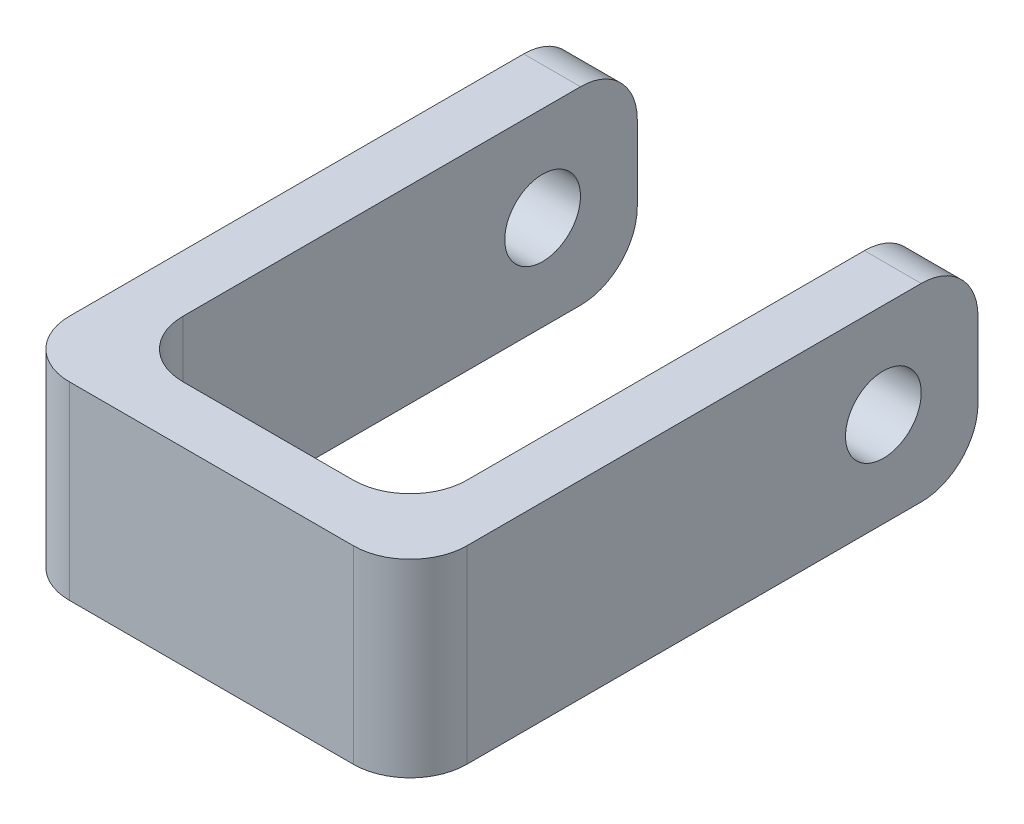
ISO-10303-21;
HEADER;
FILE_DESCRIPTION(('STEP AP214'),'2;1');
FILE_NAME('part.step','',(''),(''),'','','');
FILE_SCHEMA(('AUTOMOTIVE_DESIGN { 1 0 10303 214 1 1 1 1 }'));
ENDSEC;
DATA;
#1=APPLICATION_CONTEXT('core data for automotive mechanical design processes');
#2=APPLICATION_PROTOCOL_DEFINITION('international standard','automotive_design',2000,#1);
#3=PRODUCT_CONTEXT('',#1,'mechanical');
#4=PRODUCT('Part','Part','',(#3));
#5=PRODUCT_RELATED_PRODUCT_CATEGORY('part','',(#4));
#6=PRODUCT_DEFINITION_FORMATION('','',#4);
#7=PRODUCT_DEFINITION_CONTEXT('part definition',#1,'design');
#8=PRODUCT_DEFINITION('design','',#6,#7);
#9=PRODUCT_DEFINITION_SHAPE('','',#8);
#10=(LENGTH_UNIT() NAMED_UNIT(*) SI_UNIT(.MILLI.,.METRE.));
#11=(NAMED_UNIT(*) PLANE_ANGLE_UNIT() SI_UNIT($,.RADIAN.));
#12=(NAMED_UNIT(*) SI_UNIT($,.STERADIAN.) SOLID_ANGLE_UNIT());
#13=UNCERTAINTY_MEASURE_WITH_UNIT(LENGTH_MEASURE(1.E-05),#10,'distance_accuracy_value','');
#14=(GEOMETRIC_REPRESENTATION_CONTEXT(3) GLOBAL_UNCERTAINTY_ASSIGNED_CONTEXT((#13)) GLOBAL_UNIT_ASSIGNED_CONTEXT((#10,
#11,#12)) REPRESENTATION_CONTEXT('',''));
#15=CARTESIAN_POINT('',(0.,0.,0.));
#16=DIRECTION('',(0.,0.,1.));
#17=DIRECTION('',(1.,0.,0.));
#18=AXIS2_PLACEMENT_3D('',#15,#16,#17);
#19=CARTESIAN_POINT('',(0.,0.,-60.));
#20=DIRECTION('',(0.,0.,-1.));
#21=DIRECTION('',(-1.,0.,0.));
#22=AXIS2_PLACEMENT_3D('',#19,#20,#21);
#23=PLANE('',#22);
#24=DIRECTION('',(0.,-1.,0.));
#25=VECTOR('',#24,1.);
#26=CARTESIAN_POINT('',(-21.,10.,-60.));
#27=LINE('',#26,#25);
#28=CARTESIAN_POINT('',(-21.,4.,-60.));
#29=VERTEX_POINT('',#28);
#30=CARTESIAN_POINT('',(-21.,-4.,-60.));
#31=VERTEX_POINT('',#30);
#32=EDGE_CURVE('E240',#29,#31,#27,.T.);
#33=ORIENTED_EDGE('',*,*,#32,.F.);
#34=DIRECTION('',(-1.,0.,0.));
#35=VECTOR('',#34,1.);
#36=CARTESIAN_POINT('',(0.,4.,-60.));
#37=LINE('',#36,#35);
#38=CARTESIAN_POINT('',(-15.,4.,-60.));
#39=VERTEX_POINT('',#38);
#40=EDGE_CURVE('E173',#29,#39,#37,.F.);
#41=ORIENTED_EDGE('',*,*,#40,.T.);
#42=DIRECTION('',(0.,-1.,0.));
#43=VECTOR('',#42,1.);
#44=CARTESIAN_POINT('',(-15.,10.,-60.));
#45=LINE('',#44,#43);
#46=CARTESIAN_POINT('',(-15.,-4.,-60.));
#47=VERTEX_POINT('',#46);
#48=EDGE_CURVE('E237',#39,#47,#45,.T.);
#49=ORIENTED_EDGE('',*,*,#48,.T.);
#50=DIRECTION('',(1.,0.,0.));
#51=VECTOR('',#50,1.);
#52=CARTESIAN_POINT('',(0.,-4.,-60.));
#53=LINE('',#52,#51);
#54=EDGE_CURVE('E176',#47,#31,#53,.F.);
#55=ORIENTED_EDGE('',*,*,#54,.T.);
#56=EDGE_LOOP('',(#33,#41,#49,#55));
#57=FACE_BOUND('',#56,.T.);
#58=ADVANCED_FACE('F33',(#57),#23,.T.);
#59=CARTESIAN_POINT('',(-21.,10.,-60.));
#60=DIRECTION('',(-1.,0.,0.));
#61=DIRECTION('',(0.,0.,1.));
#62=AXIS2_PLACEMENT_3D('',#59,#60,#61);
#63=PLANE('',#62);
#64=CARTESIAN_POINT('',(-21.,0.,-50.));
#65=DIRECTION('',(1.,0.,0.));
#66=DIRECTION('',(0.,0.,-1.));
#67=AXIS2_PLACEMENT_3D('',#64,#65,#66);
#68=CIRCLE('',#67,4.00000000000001);
#69=CARTESIAN_POINT('',(-21.,0.,-54.));
#70=VERTEX_POINT('',#69);
#71=EDGE_CURVE('E296',#70,#70,#68,.T.);
#72=ORIENTED_EDGE('',*,*,#71,.T.);
#73=EDGE_LOOP('',(#72));
#74=FACE_BOUND('',#73,.T.);
#75=DIRECTION('',(0.,0.,1.));
#76=VECTOR('',#75,1.);
#77=CARTESIAN_POINT('',(-21.,10.,-60.));
#78=LINE('',#77,#76);
#79=CARTESIAN_POINT('',(-21.,10.,-54.));
#80=VERTEX_POINT('',#79);
#81=CARTESIAN_POINT('',(-21.,10.,-6.));
#82=VERTEX_POINT('',#81);
#83=EDGE_CURVE('E251',#80,#82,#78,.T.);
#84=ORIENTED_EDGE('',*,*,#83,.F.);
#85=CARTESIAN_POINT('',(-21.,4.,-54.));
#86=DIRECTION('',(-1.,0.,0.));
#87=DIRECTION('',(0.,0.,1.));
#88=AXIS2_PLACEMENT_3D('',#85,#86,#87);
#89=CIRCLE('',#88,6.);
#90=EDGE_CURVE('E274',#80,#29,#89,.T.);
#91=ORIENTED_EDGE('',*,*,#90,.T.);
#92=ORIENTED_EDGE('',*,*,#32,.T.);
#93=CARTESIAN_POINT('',(-21.,-4.,-54.));
#94=DIRECTION('',(-1.,0.,0.));
#95=DIRECTION('',(0.,0.,1.));
#96=AXIS2_PLACEMENT_3D('',#93,#94,#95);
#97=CIRCLE('',#96,6.);
#98=CARTESIAN_POINT('',(-21.,-10.,-54.));
#99=VERTEX_POINT('',#98);
#100=EDGE_CURVE('E272',#31,#99,#97,.T.);
#101=ORIENTED_EDGE('',*,*,#100,.T.);
#102=DIRECTION('',(0.,0.,1.));
#103=VECTOR('',#102,1.);
#104=CARTESIAN_POINT('',(-21.,-10.,-60.));
#105=LINE('',#104,#103);
#106=CARTESIAN_POINT('',(-21.,-10.,-6.));
#107=VERTEX_POINT('',#106);
#108=EDGE_CURVE('E247',#99,#107,#105,.T.);
#109=ORIENTED_EDGE('',*,*,#108,.T.);
#110=DIRECTION('',(0.,-1.,0.));
#111=VECTOR('',#110,1.);
#112=CARTESIAN_POINT('',(-21.,10.,-6.));
#113=LINE('',#112,#111);
#114=EDGE_CURVE('E270',#107,#82,#113,.F.);
#115=ORIENTED_EDGE('',*,*,#114,.T.);
#116=EDGE_LOOP('',(#84,#91,#92,#101,#109,#115));
#117=FACE_BOUND('',#116,.T.);
#118=ADVANCED_FACE('F283',(#74,#117),#63,.T.);
#119=CARTESIAN_POINT('',(21.,10.,-60.));
#120=DIRECTION('',(0.,1.,0.));
#121=DIRECTION('',(0.,0.,1.));
#122=AXIS2_PLACEMENT_3D('',#119,#120,#121);
#123=PLANE('',#122);
#124=DIRECTION('',(0.,0.,-1.));
#125=VECTOR('',#124,1.);
#126=CARTESIAN_POINT('',(-15.,10.,-60.));
#127=LINE('',#126,#125);
#128=CARTESIAN_POINT('',(-15.,10.,-12.));
#129=VERTEX_POINT('',#128);
#130=CARTESIAN_POINT('',(-15.,10.,-54.));
#131=VERTEX_POINT('',#130);
#132=EDGE_CURVE('E153',#129,#131,#127,.T.);
#133=ORIENTED_EDGE('',*,*,#132,.T.);
#134=DIRECTION('',(-1.,0.,0.));
#135=VECTOR('',#134,1.);
#136=CARTESIAN_POINT('',(21.,10.,-54.));
#137=LINE('',#136,#135);
#138=EDGE_CURVE('E268',#131,#80,#137,.T.);
#139=ORIENTED_EDGE('',*,*,#138,.T.);
#140=ORIENTED_EDGE('',*,*,#83,.T.);
#141=CARTESIAN_POINT('',(-15.,10.,-6.));
#142=DIRECTION('',(0.,1.,0.));
#143=DIRECTION('',(0.,0.,1.));
#144=AXIS2_PLACEMENT_3D('',#141,#142,#143);
#145=CIRCLE('',#144,6.);
#146=CARTESIAN_POINT('',(-15.,10.,0.));
#147=VERTEX_POINT('',#146);
#148=EDGE_CURVE('E263',#82,#147,#145,.T.);
#149=ORIENTED_EDGE('',*,*,#148,.T.);
#150=DIRECTION('',(-1.,0.,0.));
#151=VECTOR('',#150,1.);
#152=CARTESIAN_POINT('',(21.,10.,0.));
#153=LINE('',#152,#151);
#154=CARTESIAN_POINT('',(15.,10.,0.));
#155=VERTEX_POINT('',#154);
#156=EDGE_CURVE('E244',#155,#147,#153,.T.);
#157=ORIENTED_EDGE('',*,*,#156,.F.);
#158=CARTESIAN_POINT('',(15.,10.,-6.));
#159=DIRECTION('',(0.,1.,0.));
#160=DIRECTION('',(0.,0.,1.));
#161=AXIS2_PLACEMENT_3D('',#158,#159,#160);
#162=CIRCLE('',#161,6.);
#163=CARTESIAN_POINT('',(21.,10.,-6.));
#164=VERTEX_POINT('',#163);
#165=EDGE_CURVE('E254',#155,#164,#162,.T.);
#166=ORIENTED_EDGE('',*,*,#165,.T.);
#167=DIRECTION('',(0.,0.,1.));
#168=VECTOR('',#167,1.);
#169=CARTESIAN_POINT('',(21.,10.,-60.));
#170=LINE('',#169,#168);
#171=CARTESIAN_POINT('',(21.,10.,-54.));
#172=VERTEX_POINT('',#171);
#173=EDGE_CURVE('E255',#172,#164,#170,.T.);
#174=ORIENTED_EDGE('',*,*,#173,.F.);
#175=DIRECTION('',(-1.,0.,0.));
#176=VECTOR('',#175,1.);
#177=CARTESIAN_POINT('',(21.,10.,-54.));
#178=LINE('',#177,#176);
#179=CARTESIAN_POINT('',(15.,10.,-54.));
#180=VERTEX_POINT('',#179);
#181=EDGE_CURVE('E265',#172,#180,#178,.T.);
#182=ORIENTED_EDGE('',*,*,#181,.T.);
#183=DIRECTION('',(0.,0.,1.));
#184=VECTOR('',#183,1.);
#185=CARTESIAN_POINT('',(15.,10.,-60.));
#186=LINE('',#185,#184);
#187=CARTESIAN_POINT('',(15.,10.,-12.));
#188=VERTEX_POINT('',#187);
#189=EDGE_CURVE('E169',#180,#188,#186,.T.);
#190=ORIENTED_EDGE('',*,*,#189,.T.);
#191=CARTESIAN_POINT('',(9.,10.,-12.));
#192=DIRECTION('',(0.,1.,0.));
#193=DIRECTION('',(0.,0.,1.));
#194=AXIS2_PLACEMENT_3D('',#191,#192,#193);
#195=CIRCLE('',#194,6.);
#196=CARTESIAN_POINT('',(9.,10.,-6.));
#197=VERTEX_POINT('',#196);
#198=EDGE_CURVE('E217',#188,#197,#195,.F.);
#199=ORIENTED_EDGE('',*,*,#198,.T.);
#200=DIRECTION('',(-1.,0.,0.));
#201=VECTOR('',#200,1.);
#202=CARTESIAN_POINT('',(-15.,10.,-6.));
#203=LINE('',#202,#201);
#204=CARTESIAN_POINT('',(-9.,10.,-6.));
#205=VERTEX_POINT('',#204);
#206=EDGE_CURVE('E156',#197,#205,#203,.T.);
#207=ORIENTED_EDGE('',*,*,#206,.T.);
#208=CARTESIAN_POINT('',(-9.,10.,-12.));
#209=DIRECTION('',(0.,1.,0.));
#210=DIRECTION('',(0.,0.,1.));
#211=AXIS2_PLACEMENT_3D('',#208,#209,#210);
#212=CIRCLE('',#211,6.);
#213=EDGE_CURVE('E11',#205,#129,#212,.F.);
#214=ORIENTED_EDGE('',*,*,#213,.T.);
#215=EDGE_LOOP('',(#133,#139,#140,#149,#157,#166,#174,#182,#190,#199,#207,#214));
#216=FACE_BOUND('',#215,.T.);
#217=ADVANCED_FACE('F151',(#216),#123,.T.);
#218=CARTESIAN_POINT('',(21.,10.,-60.));
#219=DIRECTION('',(1.,0.,0.));
#220=DIRECTION('',(0.,0.,-1.));
#221=AXIS2_PLACEMENT_3D('',#218,#219,#220);
#222=PLANE('',#221);
#223=CARTESIAN_POINT('',(21.,0.,-50.));
#224=DIRECTION('',(1.,0.,0.));
#225=DIRECTION('',(0.,0.,-1.));
#226=AXIS2_PLACEMENT_3D('',#223,#224,#225);
#227=CIRCLE('',#226,4.00000000000001);
#228=CARTESIAN_POINT('',(21.,0.,-54.));
#229=VERTEX_POINT('',#228);
#230=EDGE_CURVE('E293',#229,#229,#227,.T.);
#231=ORIENTED_EDGE('',*,*,#230,.F.);
#232=EDGE_LOOP('',(#231));
#233=FACE_BOUND('',#232,.T.);
#234=DIRECTION('',(0.,1.,0.));
#235=VECTOR('',#234,1.);
#236=CARTESIAN_POINT('',(21.,10.,-60.));
#237=LINE('',#236,#235);
#238=CARTESIAN_POINT('',(21.,-4.,-60.));
#239=VERTEX_POINT('',#238);
#240=CARTESIAN_POINT('',(21.,4.,-60.));
#241=VERTEX_POINT('',#240);
#242=EDGE_CURVE('E243',#239,#241,#237,.T.);
#243=ORIENTED_EDGE('',*,*,#242,.T.);
#244=CARTESIAN_POINT('',(21.,4.,-54.));
#245=DIRECTION('',(1.,0.,0.));
#246=DIRECTION('',(0.,0.,-1.));
#247=AXIS2_PLACEMENT_3D('',#244,#245,#246);
#248=CIRCLE('',#247,6.);
#249=EDGE_CURVE('E195',#241,#172,#248,.T.);
#250=ORIENTED_EDGE('',*,*,#249,.T.);
#251=ORIENTED_EDGE('',*,*,#173,.T.);
#252=DIRECTION('',(0.,1.,0.));
#253=VECTOR('',#252,1.);
#254=CARTESIAN_POINT('',(21.,-10.,-6.));
#255=LINE('',#254,#253);
#256=CARTESIAN_POINT('',(21.,-10.,-6.));
#257=VERTEX_POINT('',#256);
#258=EDGE_CURVE('E191',#164,#257,#255,.F.);
#259=ORIENTED_EDGE('',*,*,#258,.T.);
#260=DIRECTION('',(0.,0.,1.));
#261=VECTOR('',#260,1.);
#262=CARTESIAN_POINT('',(21.,-10.,-60.));
#263=LINE('',#262,#261);
#264=CARTESIAN_POINT('',(21.,-10.,-54.));
#265=VERTEX_POINT('',#264);
#266=EDGE_CURVE('E258',#265,#257,#263,.T.);
#267=ORIENTED_EDGE('',*,*,#266,.F.);
#268=CARTESIAN_POINT('',(21.,-4.,-54.));
#269=DIRECTION('',(1.,0.,0.));
#270=DIRECTION('',(0.,0.,-1.));
#271=AXIS2_PLACEMENT_3D('',#268,#269,#270);
#272=CIRCLE('',#271,6.);
#273=EDGE_CURVE('E193',#265,#239,#272,.T.);
#274=ORIENTED_EDGE('',*,*,#273,.T.);
#275=EDGE_LOOP('',(#243,#250,#251,#259,#267,#274));
#276=FACE_BOUND('',#275,.T.);
#277=ADVANCED_FACE('F335',(#233,#276),#222,.T.);
#278=CARTESIAN_POINT('',(21.,-10.,-60.));
#279=DIRECTION('',(0.,-1.,0.));
#280=DIRECTION('',(0.,0.,-1.));
#281=AXIS2_PLACEMENT_3D('',#278,#279,#280);
#282=PLANE('',#281);
#283=ORIENTED_EDGE('',*,*,#108,.F.);
#284=DIRECTION('',(1.,0.,0.));
#285=VECTOR('',#284,1.);
#286=CARTESIAN_POINT('',(21.,-10.,-54.));
#287=LINE('',#286,#285);
#288=CARTESIAN_POINT('',(-15.,-10.,-54.));
#289=VERTEX_POINT('',#288);
#290=EDGE_CURVE('E202',#99,#289,#287,.T.);
#291=ORIENTED_EDGE('',*,*,#290,.T.);
#292=DIRECTION('',(0.,0.,-1.));
#293=VECTOR('',#292,1.);
#294=CARTESIAN_POINT('',(-15.,-10.,-60.));
#295=LINE('',#294,#293);
#296=CARTESIAN_POINT('',(-15.,-10.,-12.));
#297=VERTEX_POINT('',#296);
#298=EDGE_CURVE('E223',#297,#289,#295,.T.);
#299=ORIENTED_EDGE('',*,*,#298,.F.);
#300=CARTESIAN_POINT('',(-9.,-10.,-12.));
#301=DIRECTION('',(0.,-1.,0.));
#302=DIRECTION('',(0.,0.,-1.));
#303=AXIS2_PLACEMENT_3D('',#300,#301,#302);
#304=CIRCLE('',#303,6.);
#305=CARTESIAN_POINT('',(-9.,-10.,-6.));
#306=VERTEX_POINT('',#305);
#307=EDGE_CURVE('E42',#297,#306,#304,.F.);
#308=ORIENTED_EDGE('',*,*,#307,.T.);
#309=DIRECTION('',(-1.,0.,0.));
#310=VECTOR('',#309,1.);
#311=CARTESIAN_POINT('',(-15.,-10.,-6.));
#312=LINE('',#311,#310);
#313=CARTESIAN_POINT('',(9.,-10.,-6.));
#314=VERTEX_POINT('',#313);
#315=EDGE_CURVE('E170',#314,#306,#312,.T.);
#316=ORIENTED_EDGE('',*,*,#315,.F.);
#317=CARTESIAN_POINT('',(9.,-10.,-12.));
#318=DIRECTION('',(0.,-1.,0.));
#319=DIRECTION('',(0.,0.,-1.));
#320=AXIS2_PLACEMENT_3D('',#317,#318,#319);
#321=CIRCLE('',#320,6.);
#322=CARTESIAN_POINT('',(15.,-10.,-12.));
#323=VERTEX_POINT('',#322);
#324=EDGE_CURVE('E215',#314,#323,#321,.F.);
#325=ORIENTED_EDGE('',*,*,#324,.T.);
#326=DIRECTION('',(0.,0.,1.));
#327=VECTOR('',#326,1.);
#328=CARTESIAN_POINT('',(15.,-10.,-60.));
#329=LINE('',#328,#327);
#330=CARTESIAN_POINT('',(15.,-10.,-54.));
#331=VERTEX_POINT('',#330);
#332=EDGE_CURVE('E227',#331,#323,#329,.T.);
#333=ORIENTED_EDGE('',*,*,#332,.F.);
#334=DIRECTION('',(1.,0.,0.));
#335=VECTOR('',#334,1.);
#336=CARTESIAN_POINT('',(21.,-10.,-54.));
#337=LINE('',#336,#335);
#338=EDGE_CURVE('E199',#331,#265,#337,.T.);
#339=ORIENTED_EDGE('',*,*,#338,.T.);
#340=ORIENTED_EDGE('',*,*,#266,.T.);
#341=CARTESIAN_POINT('',(15.,-10.,-6.));
#342=DIRECTION('',(0.,-1.,0.));
#343=DIRECTION('',(0.,0.,-1.));
#344=AXIS2_PLACEMENT_3D('',#341,#342,#343);
#345=CIRCLE('',#344,6.);
#346=CARTESIAN_POINT('',(15.,-10.,0.));
#347=VERTEX_POINT('',#346);
#348=EDGE_CURVE('E49',#257,#347,#345,.T.);
#349=ORIENTED_EDGE('',*,*,#348,.T.);
#350=DIRECTION('',(1.,0.,0.));
#351=VECTOR('',#350,1.);
#352=CARTESIAN_POINT('',(21.,-10.,0.));
#353=LINE('',#352,#351);
#354=CARTESIAN_POINT('',(-15.,-10.,0.));
#355=VERTEX_POINT('',#354);
#356=EDGE_CURVE('E236',#355,#347,#353,.T.);
#357=ORIENTED_EDGE('',*,*,#356,.F.);
#358=CARTESIAN_POINT('',(-15.,-10.,-6.));
#359=DIRECTION('',(0.,-1.,0.));
#360=DIRECTION('',(0.,0.,-1.));
#361=AXIS2_PLACEMENT_3D('',#358,#359,#360);
#362=CIRCLE('',#361,6.);
#363=EDGE_CURVE('E57',#355,#107,#362,.T.);
#364=ORIENTED_EDGE('',*,*,#363,.T.);
#365=EDGE_LOOP('',(#283,#291,#299,#308,#316,#325,#333,#339,#340,#349,#357,#364));
#366=FACE_BOUND('',#365,.T.);
#367=ADVANCED_FACE('F222',(#366),#282,.T.);
#368=DIRECTION('',(0.,-1.,0.));
#369=VECTOR('',#368,1.);
#370=CARTESIAN_POINT('',(15.,10.,-60.));
#371=LINE('',#370,#369);
#372=CARTESIAN_POINT('',(15.,4.,-60.));
#373=VERTEX_POINT('',#372);
#374=CARTESIAN_POINT('',(15.,-4.,-60.));
#375=VERTEX_POINT('',#374);
#376=EDGE_CURVE('E233',#373,#375,#371,.T.);
#377=ORIENTED_EDGE('',*,*,#376,.F.);
#378=DIRECTION('',(-1.,0.,0.));
#379=VECTOR('',#378,1.);
#380=CARTESIAN_POINT('',(0.,4.,-60.));
#381=LINE('',#380,#379);
#382=EDGE_CURVE('E189',#373,#241,#381,.F.);
#383=ORIENTED_EDGE('',*,*,#382,.T.);
#384=ORIENTED_EDGE('',*,*,#242,.F.);
#385=DIRECTION('',(1.,0.,0.));
#386=VECTOR('',#385,1.);
#387=CARTESIAN_POINT('',(0.,-4.,-60.));
#388=LINE('',#387,#386);
#389=EDGE_CURVE('E187',#239,#375,#388,.F.);
#390=ORIENTED_EDGE('',*,*,#389,.T.);
#391=EDGE_LOOP('',(#377,#383,#384,#390));
#392=FACE_BOUND('',#391,.T.);
#393=ADVANCED_FACE('F320',(#392),#23,.T.);
#394=CARTESIAN_POINT('',(0.,0.,0.));
#395=DIRECTION('',(0.,0.,-1.));
#396=DIRECTION('',(-1.,0.,0.));
#397=AXIS2_PLACEMENT_3D('',#394,#395,#396);
#398=PLANE('',#397);
#399=ORIENTED_EDGE('',*,*,#156,.T.);
#400=DIRECTION('',(0.,-1.,0.));
#401=VECTOR('',#400,1.);
#402=CARTESIAN_POINT('',(-15.,-10.,0.));
#403=LINE('',#402,#401);
#404=EDGE_CURVE('E208',#147,#355,#403,.T.);
#405=ORIENTED_EDGE('',*,*,#404,.T.);
#406=ORIENTED_EDGE('',*,*,#356,.T.);
#407=DIRECTION('',(0.,1.,0.));
#408=VECTOR('',#407,1.);
#409=CARTESIAN_POINT('',(15.,10.,0.));
#410=LINE('',#409,#408);
#411=EDGE_CURVE('E205',#347,#155,#410,.T.);
#412=ORIENTED_EDGE('',*,*,#411,.T.);
#413=EDGE_LOOP('',(#399,#405,#406,#412));
#414=FACE_BOUND('',#413,.T.);
#415=ADVANCED_FACE('F328',(#414),#398,.F.);
#416=CARTESIAN_POINT('',(-15.,10.,-60.));
#417=DIRECTION('',(-1.,0.,0.));
#418=DIRECTION('',(0.,0.,1.));
#419=AXIS2_PLACEMENT_3D('',#416,#417,#418);
#420=PLANE('',#419);
#421=CARTESIAN_POINT('',(-15.,0.,-50.));
#422=DIRECTION('',(-1.,0.,0.));
#423=DIRECTION('',(0.,0.,1.));
#424=AXIS2_PLACEMENT_3D('',#421,#422,#423);
#425=CIRCLE('',#424,4.00000000000001);
#426=CARTESIAN_POINT('',(-15.,0.,-46.));
#427=VERTEX_POINT('',#426);
#428=EDGE_CURVE('E286',#427,#427,#425,.T.);
#429=ORIENTED_EDGE('',*,*,#428,.T.);
#430=EDGE_LOOP('',(#429));
#431=FACE_BOUND('',#430,.T.);
#432=ORIENTED_EDGE('',*,*,#48,.F.);
#433=CARTESIAN_POINT('',(-15.,4.,-54.));
#434=DIRECTION('',(-1.,0.,0.));
#435=DIRECTION('',(0.,0.,1.));
#436=AXIS2_PLACEMENT_3D('',#433,#434,#435);
#437=CIRCLE('',#436,6.);
#438=EDGE_CURVE('E168',#39,#131,#437,.F.);
#439=ORIENTED_EDGE('',*,*,#438,.T.);
#440=ORIENTED_EDGE('',*,*,#132,.F.);
#441=DIRECTION('',(0.,-1.,0.));
#442=VECTOR('',#441,1.);
#443=CARTESIAN_POINT('',(-15.,-10.,-12.));
#444=LINE('',#443,#442);
#445=EDGE_CURVE('E165',#129,#297,#444,.T.);
#446=ORIENTED_EDGE('',*,*,#445,.T.);
#447=ORIENTED_EDGE('',*,*,#298,.T.);
#448=CARTESIAN_POINT('',(-15.,-4.,-54.));
#449=DIRECTION('',(-1.,0.,0.));
#450=DIRECTION('',(0.,0.,1.));
#451=AXIS2_PLACEMENT_3D('',#448,#449,#450);
#452=CIRCLE('',#451,6.);
#453=EDGE_CURVE('E172',#289,#47,#452,.F.);
#454=ORIENTED_EDGE('',*,*,#453,.T.);
#455=EDGE_LOOP('',(#432,#439,#440,#446,#447,#454));
#456=FACE_BOUND('',#455,.T.);
#457=ADVANCED_FACE('F163',(#431,#456),#420,.F.);
#458=CARTESIAN_POINT('',(-15.,10.,-6.));
#459=DIRECTION('',(0.,0.,1.));
#460=DIRECTION('',(0.,-1.,0.));
#461=AXIS2_PLACEMENT_3D('',#458,#459,#460);
#462=PLANE('',#461);
#463=ORIENTED_EDGE('',*,*,#206,.F.);
#464=DIRECTION('',(0.,-1.,0.));
#465=VECTOR('',#464,1.);
#466=CARTESIAN_POINT('',(9.,-10.,-6.));
#467=LINE('',#466,#465);
#468=EDGE_CURVE('E212',#197,#314,#467,.T.);
#469=ORIENTED_EDGE('',*,*,#468,.T.);
#470=ORIENTED_EDGE('',*,*,#315,.T.);
#471=DIRECTION('',(0.,-1.,0.));
#472=VECTOR('',#471,1.);
#473=CARTESIAN_POINT('',(-9.,10.,-6.));
#474=LINE('',#473,#472);
#475=EDGE_CURVE('E210',#306,#205,#474,.F.);
#476=ORIENTED_EDGE('',*,*,#475,.T.);
#477=EDGE_LOOP('',(#463,#469,#470,#476));
#478=FACE_BOUND('',#477,.T.);
#479=ADVANCED_FACE('F225',(#478),#462,.F.);
#480=CARTESIAN_POINT('',(15.,10.,-60.));
#481=DIRECTION('',(1.,0.,0.));
#482=DIRECTION('',(0.,0.,-1.));
#483=AXIS2_PLACEMENT_3D('',#480,#481,#482);
#484=PLANE('',#483);
#485=CARTESIAN_POINT('',(15.,0.,-50.));
#486=DIRECTION('',(1.,0.,0.));
#487=DIRECTION('',(0.,0.,-1.));
#488=AXIS2_PLACEMENT_3D('',#485,#486,#487);
#489=CIRCLE('',#488,4.00000000000001);
#490=CARTESIAN_POINT('',(15.,0.,-54.));
#491=VERTEX_POINT('',#490);
#492=EDGE_CURVE('E37',#491,#491,#489,.T.);
#493=ORIENTED_EDGE('',*,*,#492,.T.);
#494=EDGE_LOOP('',(#493));
#495=FACE_BOUND('',#494,.T.);
#496=ORIENTED_EDGE('',*,*,#189,.F.);
#497=CARTESIAN_POINT('',(15.,4.,-54.));
#498=DIRECTION('',(1.,0.,0.));
#499=DIRECTION('',(0.,0.,-1.));
#500=AXIS2_PLACEMENT_3D('',#497,#498,#499);
#501=CIRCLE('',#500,6.);
#502=EDGE_CURVE('E185',#180,#373,#501,.F.);
#503=ORIENTED_EDGE('',*,*,#502,.T.);
#504=ORIENTED_EDGE('',*,*,#376,.T.);
#505=CARTESIAN_POINT('',(15.,-4.,-54.));
#506=DIRECTION('',(1.,0.,0.));
#507=DIRECTION('',(0.,0.,-1.));
#508=AXIS2_PLACEMENT_3D('',#505,#506,#507);
#509=CIRCLE('',#508,6.);
#510=EDGE_CURVE('E183',#375,#331,#509,.F.);
#511=ORIENTED_EDGE('',*,*,#510,.T.);
#512=ORIENTED_EDGE('',*,*,#332,.T.);
#513=DIRECTION('',(0.,-1.,0.));
#514=VECTOR('',#513,1.);
#515=CARTESIAN_POINT('',(15.,10.,-12.));
#516=LINE('',#515,#514);
#517=EDGE_CURVE('E181',#323,#188,#516,.F.);
#518=ORIENTED_EDGE('',*,*,#517,.T.);
#519=EDGE_LOOP('',(#496,#503,#504,#511,#512,#518));
#520=FACE_BOUND('',#519,.T.);
#521=ADVANCED_FACE('F303',(#495,#520),#484,.F.);
#522=CARTESIAN_POINT('',(21.,4.,-54.));
#523=DIRECTION('',(-1.,0.,0.));
#524=DIRECTION('',(0.,0.,1.));
#525=AXIS2_PLACEMENT_3D('',#522,#523,#524);
#526=CYLINDRICAL_SURFACE('',#525,6.);
#527=ORIENTED_EDGE('',*,*,#438,.F.);
#528=ORIENTED_EDGE('',*,*,#40,.F.);
#529=ORIENTED_EDGE('',*,*,#90,.F.);
#530=ORIENTED_EDGE('',*,*,#138,.F.);
#531=EDGE_LOOP('',(#527,#528,#529,#530));
#532=FACE_BOUND('',#531,.T.);
#533=ADVANCED_FACE('F357',(#532),#526,.T.);
#534=CARTESIAN_POINT('',(21.,4.,-54.));
#535=DIRECTION('',(-1.,0.,0.));
#536=DIRECTION('',(0.,0.,1.));
#537=AXIS2_PLACEMENT_3D('',#534,#535,#536);
#538=CYLINDRICAL_SURFACE('',#537,6.);
#539=ORIENTED_EDGE('',*,*,#249,.F.);
#540=ORIENTED_EDGE('',*,*,#382,.F.);
#541=ORIENTED_EDGE('',*,*,#502,.F.);
#542=ORIENTED_EDGE('',*,*,#181,.F.);
#543=EDGE_LOOP('',(#539,#540,#541,#542));
#544=FACE_BOUND('',#543,.T.);
#545=ADVANCED_FACE('F344',(#544),#538,.T.);
#546=CARTESIAN_POINT('',(21.,-4.,-54.));
#547=DIRECTION('',(1.,0.,0.));
#548=DIRECTION('',(0.,0.,-1.));
#549=AXIS2_PLACEMENT_3D('',#546,#547,#548);
#550=CYLINDRICAL_SURFACE('',#549,6.);
#551=ORIENTED_EDGE('',*,*,#100,.F.);
#552=ORIENTED_EDGE('',*,*,#54,.F.);
#553=ORIENTED_EDGE('',*,*,#453,.F.);
#554=ORIENTED_EDGE('',*,*,#290,.F.);
#555=EDGE_LOOP('',(#551,#552,#553,#554));
#556=FACE_BOUND('',#555,.T.);
#557=ADVANCED_FACE('F285',(#556),#550,.T.);
#558=CARTESIAN_POINT('',(21.,-4.,-54.));
#559=DIRECTION('',(1.,0.,0.));
#560=DIRECTION('',(0.,0.,-1.));
#561=AXIS2_PLACEMENT_3D('',#558,#559,#560);
#562=CYLINDRICAL_SURFACE('',#561,6.);
#563=ORIENTED_EDGE('',*,*,#510,.F.);
#564=ORIENTED_EDGE('',*,*,#389,.F.);
#565=ORIENTED_EDGE('',*,*,#273,.F.);
#566=ORIENTED_EDGE('',*,*,#338,.F.);
#567=EDGE_LOOP('',(#563,#564,#565,#566));
#568=FACE_BOUND('',#567,.T.);
#569=ADVANCED_FACE('F369',(#568),#562,.T.);
#570=CARTESIAN_POINT('',(-15.,0.,-6.));
#571=DIRECTION('',(0.,1.,0.));
#572=DIRECTION('',(0.,0.,1.));
#573=AXIS2_PLACEMENT_3D('',#570,#571,#572);
#574=CYLINDRICAL_SURFACE('',#573,6.);
#575=ORIENTED_EDGE('',*,*,#148,.F.);
#576=ORIENTED_EDGE('',*,*,#114,.F.);
#577=ORIENTED_EDGE('',*,*,#363,.F.);
#578=ORIENTED_EDGE('',*,*,#404,.F.);
#579=EDGE_LOOP('',(#575,#576,#577,#578));
#580=FACE_BOUND('',#579,.T.);
#581=ADVANCED_FACE('F355',(#580),#574,.T.);
#582=CARTESIAN_POINT('',(15.,0.,-6.));
#583=DIRECTION('',(0.,-1.,0.));
#584=DIRECTION('',(0.,0.,-1.));
#585=AXIS2_PLACEMENT_3D('',#582,#583,#584);
#586=CYLINDRICAL_SURFACE('',#585,6.);
#587=ORIENTED_EDGE('',*,*,#348,.F.);
#588=ORIENTED_EDGE('',*,*,#258,.F.);
#589=ORIENTED_EDGE('',*,*,#165,.F.);
#590=ORIENTED_EDGE('',*,*,#411,.F.);
#591=EDGE_LOOP('',(#587,#588,#589,#590));
#592=FACE_BOUND('',#591,.T.);
#593=ADVANCED_FACE('F353',(#592),#586,.T.);
#594=CARTESIAN_POINT('',(9.,10.,-12.));
#595=DIRECTION('',(0.,1.,0.));
#596=DIRECTION('',(0.,0.,1.));
#597=AXIS2_PLACEMENT_3D('',#594,#595,#596);
#598=CYLINDRICAL_SURFACE('',#597,6.);
#599=ORIENTED_EDGE('',*,*,#198,.F.);
#600=ORIENTED_EDGE('',*,*,#517,.F.);
#601=ORIENTED_EDGE('',*,*,#324,.F.);
#602=ORIENTED_EDGE('',*,*,#468,.F.);
#603=EDGE_LOOP('',(#599,#600,#601,#602));
#604=FACE_BOUND('',#603,.T.);
#605=ADVANCED_FACE('F316',(#604),#598,.F.);
#606=CARTESIAN_POINT('',(-9.,10.,-12.));
#607=DIRECTION('',(0.,1.,0.));
#608=DIRECTION('',(0.,0.,1.));
#609=AXIS2_PLACEMENT_3D('',#606,#607,#608);
#610=CYLINDRICAL_SURFACE('',#609,6.);
#611=ORIENTED_EDGE('',*,*,#213,.F.);
#612=ORIENTED_EDGE('',*,*,#475,.F.);
#613=ORIENTED_EDGE('',*,*,#307,.F.);
#614=ORIENTED_EDGE('',*,*,#445,.F.);
#615=EDGE_LOOP('',(#611,#612,#613,#614));
#616=FACE_BOUND('',#615,.T.);
#617=ADVANCED_FACE('F35',(#616),#610,.F.);
#618=CARTESIAN_POINT('',(-21.,0.,-50.));
#619=DIRECTION('',(1.,0.,0.));
#620=DIRECTION('',(0.,0.,-1.));
#621=AXIS2_PLACEMENT_3D('',#618,#619,#620);
#622=CYLINDRICAL_SURFACE('',#621,4.00000000000001);
#623=ORIENTED_EDGE('',*,*,#230,.T.);
#624=EDGE_LOOP('',(#623));
#625=FACE_BOUND('',#624,.T.);
#626=ORIENTED_EDGE('',*,*,#492,.F.);
#627=EDGE_LOOP('',(#626));
#628=FACE_BOUND('',#627,.T.);
#629=ADVANCED_FACE('F306',(#625,#628),#622,.F.);
#630=ORIENTED_EDGE('',*,*,#71,.F.);
#631=EDGE_LOOP('',(#630));
#632=FACE_BOUND('',#631,.T.);
#633=ORIENTED_EDGE('',*,*,#428,.F.);
#634=EDGE_LOOP('',(#633));
#635=FACE_BOUND('',#634,.T.);
#636=ADVANCED_FACE('F308',(#632,#635),#622,.F.);
#637=CLOSED_SHELL('',(#58,#118,#217,#277,#367,#393,#415,#457,#479,#521,#533,#545,#557,#569,#581,
#593,#605,#617,#629,#636));
#638=MANIFOLD_SOLID_BREP('B2',#637);
#639=ADVANCED_BREP_SHAPE_REPRESENTATION('',(#18,#638),#14);
#640=SHAPE_DEFINITION_REPRESENTATION(#9,#639);
ENDSEC;
END-ISO-10303-21;
